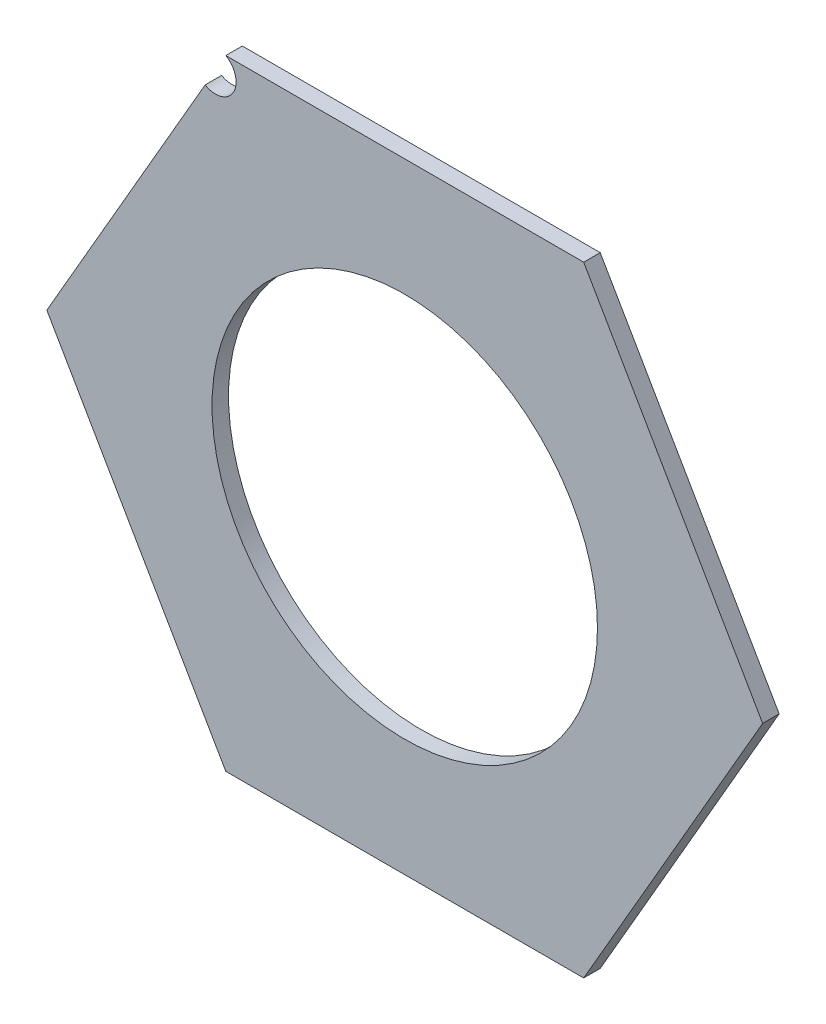
ISO-10303-21;
HEADER;
FILE_DESCRIPTION(('STEP AP214'),'2;1');
FILE_NAME('part.step','',(''),(''),'','','');
FILE_SCHEMA(('AUTOMOTIVE_DESIGN { 1 0 10303 214 1 1 1 1 }'));
ENDSEC;
DATA;
#1=APPLICATION_CONTEXT('core data for automotive mechanical design processes');
#2=APPLICATION_PROTOCOL_DEFINITION('international standard','automotive_design',2000,#1);
#3=PRODUCT_CONTEXT('',#1,'mechanical');
#4=PRODUCT('Part','Part','',(#3));
#5=PRODUCT_RELATED_PRODUCT_CATEGORY('part','',(#4));
#6=PRODUCT_DEFINITION_FORMATION('','',#4);
#7=PRODUCT_DEFINITION_CONTEXT('part definition',#1,'design');
#8=PRODUCT_DEFINITION('design','',#6,#7);
#9=PRODUCT_DEFINITION_SHAPE('','',#8);
#10=(LENGTH_UNIT() NAMED_UNIT(*) SI_UNIT(.MILLI.,.METRE.));
#11=(NAMED_UNIT(*) PLANE_ANGLE_UNIT() SI_UNIT($,.RADIAN.));
#12=(NAMED_UNIT(*) SI_UNIT($,.STERADIAN.) SOLID_ANGLE_UNIT());
#13=UNCERTAINTY_MEASURE_WITH_UNIT(LENGTH_MEASURE(1.E-05),#10,'distance_accuracy_value','');
#14=(GEOMETRIC_REPRESENTATION_CONTEXT(3) GLOBAL_UNCERTAINTY_ASSIGNED_CONTEXT((#13)) GLOBAL_UNIT_ASSIGNED_CONTEXT((#10,
#11,#12)) REPRESENTATION_CONTEXT('',''));
#15=CARTESIAN_POINT('',(0.,0.,0.));
#16=DIRECTION('',(0.,0.,1.));
#17=DIRECTION('',(1.,0.,0.));
#18=AXIS2_PLACEMENT_3D('',#15,#16,#17);
#19=CARTESIAN_POINT('',(-34.375,53.0440559817969,3.));
#20=DIRECTION('',(0.,0.,1.));
#21=DIRECTION('',(1.,0.,0.));
#22=AXIS2_PLACEMENT_3D('',#19,#20,#21);
#23=PLANE('',#22);
#24=DIRECTION('',(-0.5,-0.866025403784439,0.));
#25=VECTOR('',#24,1.);
#26=CARTESIAN_POINT('',(-36.25,49.7964607176052,3.));
#27=LINE('',#26,#25);
#28=CARTESIAN_POINT('',(-36.25,49.7964607176053,3.));
#29=VERTEX_POINT('',#28);
#30=CARTESIAN_POINT('',(-65.,0.,3.));
#31=VERTEX_POINT('',#30);
#32=EDGE_CURVE('E159',#29,#31,#27,.T.);
#33=ORIENTED_EDGE('',*,*,#32,.T.);
#34=DIRECTION('',(0.5,-0.866025403784438,0.));
#35=VECTOR('',#34,1.);
#36=CARTESIAN_POINT('',(-65.,0.,3.));
#37=LINE('',#36,#35);
#38=CARTESIAN_POINT('',(-32.5,-56.2916512459885,3.));
#39=VERTEX_POINT('',#38);
#40=EDGE_CURVE('E101',#31,#39,#37,.T.);
#41=ORIENTED_EDGE('',*,*,#40,.T.);
#42=DIRECTION('',(1.,0.,0.));
#43=VECTOR('',#42,1.);
#44=CARTESIAN_POINT('',(-32.5,-56.2916512459885,3.));
#45=LINE('',#44,#43);
#46=CARTESIAN_POINT('',(32.5,-56.2916512459885,3.));
#47=VERTEX_POINT('',#46);
#48=EDGE_CURVE('E176',#39,#47,#45,.T.);
#49=ORIENTED_EDGE('',*,*,#48,.T.);
#50=DIRECTION('',(0.5,0.866025403784439,0.));
#51=VECTOR('',#50,1.);
#52=CARTESIAN_POINT('',(32.5,-56.2916512459885,3.));
#53=LINE('',#52,#51);
#54=CARTESIAN_POINT('',(65.,0.,3.));
#55=VERTEX_POINT('',#54);
#56=EDGE_CURVE('E117',#47,#55,#53,.T.);
#57=ORIENTED_EDGE('',*,*,#56,.T.);
#58=DIRECTION('',(-0.5,0.866025403784438,0.));
#59=VECTOR('',#58,1.);
#60=CARTESIAN_POINT('',(65.,0.,3.));
#61=LINE('',#60,#59);
#62=CARTESIAN_POINT('',(32.5,56.2916512459885,3.));
#63=VERTEX_POINT('',#62);
#64=EDGE_CURVE('E111',#55,#63,#61,.T.);
#65=ORIENTED_EDGE('',*,*,#64,.T.);
#66=DIRECTION('',(-1.,0.,0.));
#67=VECTOR('',#66,1.);
#68=CARTESIAN_POINT('',(32.5,56.2916512459885,3.));
#69=LINE('',#68,#67);
#70=CARTESIAN_POINT('',(-32.5,56.2916512459885,3.));
#71=VERTEX_POINT('',#70);
#72=EDGE_CURVE('E115',#63,#71,#69,.T.);
#73=ORIENTED_EDGE('',*,*,#72,.T.);
#74=CARTESIAN_POINT('',(-34.375,53.0440559817969,3.));
#75=DIRECTION('',(0.,0.,-1.));
#76=DIRECTION('',(1.,0.,0.));
#77=AXIS2_PLACEMENT_3D('',#74,#75,#76);
#78=CIRCLE('',#77,3.75);
#79=EDGE_CURVE('E61',#71,#29,#78,.T.);
#80=ORIENTED_EDGE('',*,*,#79,.T.);
#81=EDGE_LOOP('',(#33,#41,#49,#57,#65,#73,#80));
#82=FACE_BOUND('',#81,.T.);
#83=CARTESIAN_POINT('',(0.,0.,3.));
#84=DIRECTION('',(0.,0.,1.));
#85=DIRECTION('',(1.,0.,0.));
#86=AXIS2_PLACEMENT_3D('',#83,#84,#85);
#87=CIRCLE('',#86,35.);
#88=CARTESIAN_POINT('',(35.,0.,3.));
#89=VERTEX_POINT('',#88);
#90=EDGE_CURVE('E144',#89,#89,#87,.T.);
#91=ORIENTED_EDGE('',*,*,#90,.F.);
#92=EDGE_LOOP('',(#91));
#93=FACE_BOUND('',#92,.T.);
#94=ADVANCED_FACE('F43',(#82,#93),#23,.T.);
#95=CARTESIAN_POINT('',(-34.375,53.0440559817969,0.));
#96=DIRECTION('',(0.,0.,1.));
#97=DIRECTION('',(1.,0.,0.));
#98=AXIS2_PLACEMENT_3D('',#95,#96,#97);
#99=PLANE('',#98);
#100=DIRECTION('',(-0.5,-0.866025403784439,0.));
#101=VECTOR('',#100,1.);
#102=CARTESIAN_POINT('',(-36.25,49.7964607176052,0.));
#103=LINE('',#102,#101);
#104=CARTESIAN_POINT('',(-36.25,49.7964607176053,0.));
#105=VERTEX_POINT('',#104);
#106=CARTESIAN_POINT('',(-65.,0.,0.));
#107=VERTEX_POINT('',#106);
#108=EDGE_CURVE('E139',#105,#107,#103,.T.);
#109=ORIENTED_EDGE('',*,*,#108,.F.);
#110=CARTESIAN_POINT('',(-34.375,53.0440559817969,0.));
#111=DIRECTION('',(0.,0.,-1.));
#112=DIRECTION('',(1.,0.,0.));
#113=AXIS2_PLACEMENT_3D('',#110,#111,#112);
#114=CIRCLE('',#113,3.75);
#115=CARTESIAN_POINT('',(-32.5,56.2916512459885,0.));
#116=VERTEX_POINT('',#115);
#117=EDGE_CURVE('E93',#116,#105,#114,.T.);
#118=ORIENTED_EDGE('',*,*,#117,.F.);
#119=DIRECTION('',(-1.,0.,0.));
#120=VECTOR('',#119,1.);
#121=CARTESIAN_POINT('',(32.5,56.2916512459885,0.));
#122=LINE('',#121,#120);
#123=CARTESIAN_POINT('',(32.5,56.2916512459885,0.));
#124=VERTEX_POINT('',#123);
#125=EDGE_CURVE('E87',#124,#116,#122,.T.);
#126=ORIENTED_EDGE('',*,*,#125,.F.);
#127=DIRECTION('',(-0.5,0.866025403784438,0.));
#128=VECTOR('',#127,1.);
#129=CARTESIAN_POINT('',(65.,0.,0.));
#130=LINE('',#129,#128);
#131=CARTESIAN_POINT('',(65.,0.,0.));
#132=VERTEX_POINT('',#131);
#133=EDGE_CURVE('E126',#132,#124,#130,.T.);
#134=ORIENTED_EDGE('',*,*,#133,.F.);
#135=DIRECTION('',(0.5,0.866025403784439,0.));
#136=VECTOR('',#135,1.);
#137=CARTESIAN_POINT('',(32.5,-56.2916512459885,0.));
#138=LINE('',#137,#136);
#139=CARTESIAN_POINT('',(32.5,-56.2916512459885,0.));
#140=VERTEX_POINT('',#139);
#141=EDGE_CURVE('E150',#140,#132,#138,.T.);
#142=ORIENTED_EDGE('',*,*,#141,.F.);
#143=DIRECTION('',(1.,0.,0.));
#144=VECTOR('',#143,1.);
#145=CARTESIAN_POINT('',(-32.5,-56.2916512459885,0.));
#146=LINE('',#145,#144);
#147=CARTESIAN_POINT('',(-32.5,-56.2916512459885,0.));
#148=VERTEX_POINT('',#147);
#149=EDGE_CURVE('E147',#148,#140,#146,.T.);
#150=ORIENTED_EDGE('',*,*,#149,.F.);
#151=DIRECTION('',(0.5,-0.866025403784438,0.));
#152=VECTOR('',#151,1.);
#153=CARTESIAN_POINT('',(-65.,0.,0.));
#154=LINE('',#153,#152);
#155=EDGE_CURVE('E143',#107,#148,#154,.T.);
#156=ORIENTED_EDGE('',*,*,#155,.F.);
#157=EDGE_LOOP('',(#109,#118,#126,#134,#142,#150,#156));
#158=FACE_BOUND('',#157,.T.);
#159=CARTESIAN_POINT('',(0.,0.,0.));
#160=DIRECTION('',(0.,0.,1.));
#161=DIRECTION('',(1.,0.,0.));
#162=AXIS2_PLACEMENT_3D('',#159,#160,#161);
#163=CIRCLE('',#162,35.);
#164=CARTESIAN_POINT('',(35.,0.,0.));
#165=VERTEX_POINT('',#164);
#166=EDGE_CURVE('E192',#165,#165,#163,.T.);
#167=ORIENTED_EDGE('',*,*,#166,.T.);
#168=EDGE_LOOP('',(#167));
#169=FACE_BOUND('',#168,.T.);
#170=ADVANCED_FACE('F180',(#158,#169),#99,.F.);
#171=CARTESIAN_POINT('',(-36.25,49.7964607176052,3.));
#172=DIRECTION('',(0.866025403784439,-0.5,0.));
#173=DIRECTION('',(0.5,0.866025403784439,0.));
#174=AXIS2_PLACEMENT_3D('',#171,#172,#173);
#175=PLANE('',#174);
#176=ORIENTED_EDGE('',*,*,#108,.T.);
#177=DIRECTION('',(0.,0.,-1.));
#178=VECTOR('',#177,1.);
#179=CARTESIAN_POINT('',(-65.,0.,3.));
#180=LINE('',#179,#178);
#181=EDGE_CURVE('E11',#31,#107,#180,.T.);
#182=ORIENTED_EDGE('',*,*,#181,.F.);
#183=ORIENTED_EDGE('',*,*,#32,.F.);
#184=DIRECTION('',(0.,0.,-1.));
#185=VECTOR('',#184,1.);
#186=CARTESIAN_POINT('',(-36.25,49.7964607176053,3.));
#187=LINE('',#186,#185);
#188=EDGE_CURVE('E135',#29,#105,#187,.T.);
#189=ORIENTED_EDGE('',*,*,#188,.T.);
#190=EDGE_LOOP('',(#176,#182,#183,#189));
#191=FACE_BOUND('',#190,.T.);
#192=ADVANCED_FACE('F45',(#191),#175,.F.);
#193=CARTESIAN_POINT('',(-65.,0.,3.));
#194=DIRECTION('',(0.866025403784439,0.5,0.));
#195=DIRECTION('',(-0.5,0.866025403784439,0.));
#196=AXIS2_PLACEMENT_3D('',#193,#194,#195);
#197=PLANE('',#196);
#198=ORIENTED_EDGE('',*,*,#155,.T.);
#199=DIRECTION('',(0.,0.,-1.));
#200=VECTOR('',#199,1.);
#201=CARTESIAN_POINT('',(-32.5,-56.2916512459885,3.));
#202=LINE('',#201,#200);
#203=EDGE_CURVE('E53',#39,#148,#202,.T.);
#204=ORIENTED_EDGE('',*,*,#203,.F.);
#205=ORIENTED_EDGE('',*,*,#40,.F.);
#206=ORIENTED_EDGE('',*,*,#181,.T.);
#207=EDGE_LOOP('',(#198,#204,#205,#206));
#208=FACE_BOUND('',#207,.T.);
#209=ADVANCED_FACE('F220',(#208),#197,.F.);
#210=CARTESIAN_POINT('',(-32.5,-56.2916512459885,3.));
#211=DIRECTION('',(0.,1.,0.));
#212=DIRECTION('',(-1.,0.,0.));
#213=AXIS2_PLACEMENT_3D('',#210,#211,#212);
#214=PLANE('',#213);
#215=ORIENTED_EDGE('',*,*,#149,.T.);
#216=DIRECTION('',(0.,0.,-1.));
#217=VECTOR('',#216,1.);
#218=CARTESIAN_POINT('',(32.5,-56.2916512459885,3.));
#219=LINE('',#218,#217);
#220=EDGE_CURVE('E166',#47,#140,#219,.T.);
#221=ORIENTED_EDGE('',*,*,#220,.F.);
#222=ORIENTED_EDGE('',*,*,#48,.F.);
#223=ORIENTED_EDGE('',*,*,#203,.T.);
#224=EDGE_LOOP('',(#215,#221,#222,#223));
#225=FACE_BOUND('',#224,.T.);
#226=ADVANCED_FACE('F174',(#225),#214,.F.);
#227=CARTESIAN_POINT('',(32.5,-56.2916512459885,3.));
#228=DIRECTION('',(-0.866025403784439,0.5,0.));
#229=DIRECTION('',(-0.5,-0.866025403784439,0.));
#230=AXIS2_PLACEMENT_3D('',#227,#228,#229);
#231=PLANE('',#230);
#232=ORIENTED_EDGE('',*,*,#141,.T.);
#233=DIRECTION('',(0.,0.,-1.));
#234=VECTOR('',#233,1.);
#235=CARTESIAN_POINT('',(65.,0.,3.));
#236=LINE('',#235,#234);
#237=EDGE_CURVE('E128',#55,#132,#236,.T.);
#238=ORIENTED_EDGE('',*,*,#237,.F.);
#239=ORIENTED_EDGE('',*,*,#56,.F.);
#240=ORIENTED_EDGE('',*,*,#220,.T.);
#241=EDGE_LOOP('',(#232,#238,#239,#240));
#242=FACE_BOUND('',#241,.T.);
#243=ADVANCED_FACE('F183',(#242),#231,.F.);
#244=CARTESIAN_POINT('',(65.,0.,3.));
#245=DIRECTION('',(-0.866025403784439,-0.5,0.));
#246=DIRECTION('',(0.5,-0.866025403784439,0.));
#247=AXIS2_PLACEMENT_3D('',#244,#245,#246);
#248=PLANE('',#247);
#249=ORIENTED_EDGE('',*,*,#133,.T.);
#250=DIRECTION('',(0.,0.,-1.));
#251=VECTOR('',#250,1.);
#252=CARTESIAN_POINT('',(32.5,56.2916512459885,3.));
#253=LINE('',#252,#251);
#254=EDGE_CURVE('E123',#63,#124,#253,.T.);
#255=ORIENTED_EDGE('',*,*,#254,.F.);
#256=ORIENTED_EDGE('',*,*,#64,.F.);
#257=ORIENTED_EDGE('',*,*,#237,.T.);
#258=EDGE_LOOP('',(#249,#255,#256,#257));
#259=FACE_BOUND('',#258,.T.);
#260=ADVANCED_FACE('F124',(#259),#248,.F.);
#261=CARTESIAN_POINT('',(32.5,56.2916512459885,3.));
#262=DIRECTION('',(0.,-1.,0.));
#263=DIRECTION('',(0.,0.,-1.));
#264=AXIS2_PLACEMENT_3D('',#261,#262,#263);
#265=PLANE('',#264);
#266=ORIENTED_EDGE('',*,*,#125,.T.);
#267=DIRECTION('',(0.,0.,-1.));
#268=VECTOR('',#267,1.);
#269=CARTESIAN_POINT('',(-32.5,56.2916512459885,3.));
#270=LINE('',#269,#268);
#271=EDGE_CURVE('E129',#71,#116,#270,.T.);
#272=ORIENTED_EDGE('',*,*,#271,.F.);
#273=ORIENTED_EDGE('',*,*,#72,.F.);
#274=ORIENTED_EDGE('',*,*,#254,.T.);
#275=EDGE_LOOP('',(#266,#272,#273,#274));
#276=FACE_BOUND('',#275,.T.);
#277=ADVANCED_FACE('F131',(#276),#265,.F.);
#278=CARTESIAN_POINT('',(-34.375,53.0440559817969,3.));
#279=DIRECTION('',(0.,0.,-1.));
#280=DIRECTION('',(-1.,0.,0.));
#281=AXIS2_PLACEMENT_3D('',#278,#279,#280);
#282=CYLINDRICAL_SURFACE('',#281,3.75);
#283=ORIENTED_EDGE('',*,*,#117,.T.);
#284=ORIENTED_EDGE('',*,*,#188,.F.);
#285=ORIENTED_EDGE('',*,*,#79,.F.);
#286=ORIENTED_EDGE('',*,*,#271,.T.);
#287=EDGE_LOOP('',(#283,#284,#285,#286));
#288=FACE_BOUND('',#287,.T.);
#289=ADVANCED_FACE('F210',(#288),#282,.F.);
#290=CARTESIAN_POINT('',(0.,0.,3.));
#291=DIRECTION('',(0.,0.,-1.));
#292=DIRECTION('',(-1.,0.,0.));
#293=AXIS2_PLACEMENT_3D('',#290,#291,#292);
#294=CYLINDRICAL_SURFACE('',#293,35.);
#295=ORIENTED_EDGE('',*,*,#90,.T.);
#296=EDGE_LOOP('',(#295));
#297=FACE_BOUND('',#296,.T.);
#298=ORIENTED_EDGE('',*,*,#166,.F.);
#299=EDGE_LOOP('',(#298));
#300=FACE_BOUND('',#299,.T.);
#301=ADVANCED_FACE('F200',(#297,#300),#294,.F.);
#302=CLOSED_SHELL('',(#94,#170,#192,#209,#226,#243,#260,#277,#289,#301));
#303=MANIFOLD_SOLID_BREP('B2',#302);
#304=ADVANCED_BREP_SHAPE_REPRESENTATION('',(#18,#303),#14);
#305=SHAPE_DEFINITION_REPRESENTATION(#9,#304);
ENDSEC;
END-ISO-10303-21;
